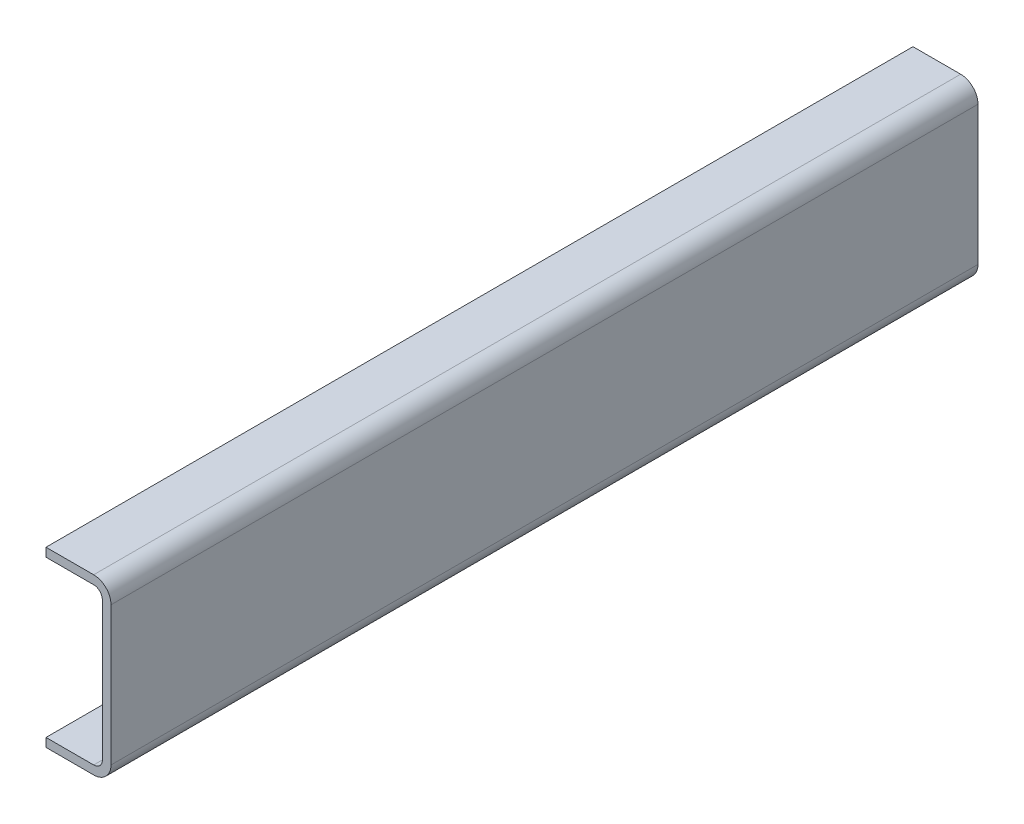
ISO-10303-21;
HEADER;
FILE_DESCRIPTION(('STEP AP214'),'2;1');
FILE_NAME('part.step','',(''),(''),'','','');
FILE_SCHEMA(('AUTOMOTIVE_DESIGN { 1 0 10303 214 1 1 1 1 }'));
ENDSEC;
DATA;
#1=APPLICATION_CONTEXT('core data for automotive mechanical design processes');
#2=APPLICATION_PROTOCOL_DEFINITION('international standard','automotive_design',2000,#1);
#3=PRODUCT_CONTEXT('',#1,'mechanical');
#4=PRODUCT('Part','Part','',(#3));
#5=PRODUCT_RELATED_PRODUCT_CATEGORY('part','',(#4));
#6=PRODUCT_DEFINITION_FORMATION('','',#4);
#7=PRODUCT_DEFINITION_CONTEXT('part definition',#1,'design');
#8=PRODUCT_DEFINITION('design','',#6,#7);
#9=PRODUCT_DEFINITION_SHAPE('','',#8);
#10=(LENGTH_UNIT() NAMED_UNIT(*) SI_UNIT(.MILLI.,.METRE.));
#11=(NAMED_UNIT(*) PLANE_ANGLE_UNIT() SI_UNIT($,.RADIAN.));
#12=(NAMED_UNIT(*) SI_UNIT($,.STERADIAN.) SOLID_ANGLE_UNIT());
#13=UNCERTAINTY_MEASURE_WITH_UNIT(LENGTH_MEASURE(1.E-05),#10,'distance_accuracy_value','');
#14=(GEOMETRIC_REPRESENTATION_CONTEXT(3) GLOBAL_UNCERTAINTY_ASSIGNED_CONTEXT((#13)) GLOBAL_UNIT_ASSIGNED_CONTEXT((#10,
#11,#12)) REPRESENTATION_CONTEXT('',''));
#15=CARTESIAN_POINT('',(0.,0.,0.));
#16=DIRECTION('',(0.,0.,1.));
#17=DIRECTION('',(1.,0.,0.));
#18=AXIS2_PLACEMENT_3D('',#15,#16,#17);
#19=CARTESIAN_POINT('',(-2.54,2.54,127.));
#20=DIRECTION('',(0.,0.,-1.));
#21=DIRECTION('',(-1.,0.,0.));
#22=AXIS2_PLACEMENT_3D('',#19,#20,#21);
#23=CYLINDRICAL_SURFACE('',#22,2.54);
#24=CARTESIAN_POINT('',(-2.54,2.54,0.));
#25=DIRECTION('',(0.,0.,1.));
#26=DIRECTION('',(-1.,0.,0.));
#27=AXIS2_PLACEMENT_3D('',#24,#25,#26);
#28=CIRCLE('',#27,2.54);
#29=CARTESIAN_POINT('',(-2.54000000000002,0.,0.));
#30=VERTEX_POINT('',#29);
#31=CARTESIAN_POINT('',(0.,2.54000000000002,0.));
#32=VERTEX_POINT('',#31);
#33=EDGE_CURVE('E189',#30,#32,#28,.T.);
#34=ORIENTED_EDGE('',*,*,#33,.T.);
#35=DIRECTION('',(0.,0.,-1.));
#36=VECTOR('',#35,1.);
#37=CARTESIAN_POINT('',(0.,2.54000000000002,127.));
#38=LINE('',#37,#36);
#39=CARTESIAN_POINT('',(0.,2.54000000000002,127.));
#40=VERTEX_POINT('',#39);
#41=EDGE_CURVE('E11',#40,#32,#38,.T.);
#42=ORIENTED_EDGE('',*,*,#41,.F.);
#43=CARTESIAN_POINT('',(-2.54,2.54,127.));
#44=DIRECTION('',(0.,0.,1.));
#45=DIRECTION('',(-1.,0.,0.));
#46=AXIS2_PLACEMENT_3D('',#43,#44,#45);
#47=CIRCLE('',#46,2.54);
#48=CARTESIAN_POINT('',(-2.54000000000002,0.,127.));
#49=VERTEX_POINT('',#48);
#50=EDGE_CURVE('E223',#49,#40,#47,.T.);
#51=ORIENTED_EDGE('',*,*,#50,.F.);
#52=DIRECTION('',(0.,0.,-1.));
#53=VECTOR('',#52,1.);
#54=CARTESIAN_POINT('',(-2.54000000000002,0.,127.));
#55=LINE('',#54,#53);
#56=EDGE_CURVE('E185',#49,#30,#55,.T.);
#57=ORIENTED_EDGE('',*,*,#56,.T.);
#58=EDGE_LOOP('',(#34,#42,#51,#57));
#59=FACE_BOUND('',#58,.T.);
#60=ADVANCED_FACE('F40',(#59),#23,.T.);
#61=CARTESIAN_POINT('',(0.,2.54000000000002,127.));
#62=DIRECTION('',(-1.,0.,0.));
#63=DIRECTION('',(0.,0.,1.));
#64=AXIS2_PLACEMENT_3D('',#61,#62,#63);
#65=PLANE('',#64);
#66=DIRECTION('',(0.,1.,0.));
#67=VECTOR('',#66,1.);
#68=CARTESIAN_POINT('',(0.,2.54000000000002,0.));
#69=LINE('',#68,#67);
#70=CARTESIAN_POINT('',(0.,22.86,0.));
#71=VERTEX_POINT('',#70);
#72=EDGE_CURVE('E193',#32,#71,#69,.T.);
#73=ORIENTED_EDGE('',*,*,#72,.T.);
#74=DIRECTION('',(0.,0.,-1.));
#75=VECTOR('',#74,1.);
#76=CARTESIAN_POINT('',(0.,22.86,127.));
#77=LINE('',#76,#75);
#78=CARTESIAN_POINT('',(0.,22.86,127.));
#79=VERTEX_POINT('',#78);
#80=EDGE_CURVE('E49',#79,#71,#77,.T.);
#81=ORIENTED_EDGE('',*,*,#80,.F.);
#82=DIRECTION('',(0.,1.,0.));
#83=VECTOR('',#82,1.);
#84=CARTESIAN_POINT('',(0.,2.54000000000002,127.));
#85=LINE('',#84,#83);
#86=EDGE_CURVE('E132',#40,#79,#85,.T.);
#87=ORIENTED_EDGE('',*,*,#86,.F.);
#88=ORIENTED_EDGE('',*,*,#41,.T.);
#89=EDGE_LOOP('',(#73,#81,#87,#88));
#90=FACE_BOUND('',#89,.T.);
#91=ADVANCED_FACE('F301',(#90),#65,.F.);
#92=CARTESIAN_POINT('',(-2.54,22.86,127.));
#93=DIRECTION('',(0.,0.,-1.));
#94=DIRECTION('',(-1.,0.,0.));
#95=AXIS2_PLACEMENT_3D('',#92,#93,#94);
#96=CYLINDRICAL_SURFACE('',#95,2.54);
#97=CARTESIAN_POINT('',(-2.54,22.86,0.));
#98=DIRECTION('',(0.,0.,1.));
#99=DIRECTION('',(1.,0.,0.));
#100=AXIS2_PLACEMENT_3D('',#97,#98,#99);
#101=CIRCLE('',#100,2.54);
#102=CARTESIAN_POINT('',(-2.54000000000002,25.4,0.));
#103=VERTEX_POINT('',#102);
#104=EDGE_CURVE('E196',#71,#103,#101,.T.);
#105=ORIENTED_EDGE('',*,*,#104,.T.);
#106=DIRECTION('',(0.,0.,-1.));
#107=VECTOR('',#106,1.);
#108=CARTESIAN_POINT('',(-2.54000000000002,25.4,127.));
#109=LINE('',#108,#107);
#110=CARTESIAN_POINT('',(-2.54000000000002,25.4,127.));
#111=VERTEX_POINT('',#110);
#112=EDGE_CURVE('E250',#111,#103,#109,.T.);
#113=ORIENTED_EDGE('',*,*,#112,.F.);
#114=CARTESIAN_POINT('',(-2.54,22.86,127.));
#115=DIRECTION('',(0.,0.,1.));
#116=DIRECTION('',(1.,0.,0.));
#117=AXIS2_PLACEMENT_3D('',#114,#115,#116);
#118=CIRCLE('',#117,2.54);
#119=EDGE_CURVE('E260',#79,#111,#118,.T.);
#120=ORIENTED_EDGE('',*,*,#119,.F.);
#121=ORIENTED_EDGE('',*,*,#80,.T.);
#122=EDGE_LOOP('',(#105,#113,#120,#121));
#123=FACE_BOUND('',#122,.T.);
#124=ADVANCED_FACE('F258',(#123),#96,.T.);
#125=CARTESIAN_POINT('',(-2.54000000000002,25.4,127.));
#126=DIRECTION('',(0.,-1.,0.));
#127=DIRECTION('',(0.,0.,-1.));
#128=AXIS2_PLACEMENT_3D('',#125,#126,#127);
#129=PLANE('',#128);
#130=DIRECTION('',(-1.,0.,0.));
#131=VECTOR('',#130,1.);
#132=CARTESIAN_POINT('',(-2.54000000000002,25.4,0.));
#133=LINE('',#132,#131);
#134=CARTESIAN_POINT('',(-9.525,25.4,0.));
#135=VERTEX_POINT('',#134);
#136=EDGE_CURVE('E199',#103,#135,#133,.T.);
#137=ORIENTED_EDGE('',*,*,#136,.T.);
#138=DIRECTION('',(0.,0.,-1.));
#139=VECTOR('',#138,1.);
#140=CARTESIAN_POINT('',(-9.525,25.4,127.));
#141=LINE('',#140,#139);
#142=CARTESIAN_POINT('',(-9.525,25.4,127.));
#143=VERTEX_POINT('',#142);
#144=EDGE_CURVE('E246',#143,#135,#141,.T.);
#145=ORIENTED_EDGE('',*,*,#144,.F.);
#146=DIRECTION('',(-1.,0.,0.));
#147=VECTOR('',#146,1.);
#148=CARTESIAN_POINT('',(-2.54000000000002,25.4,127.));
#149=LINE('',#148,#147);
#150=EDGE_CURVE('E279',#111,#143,#149,.T.);
#151=ORIENTED_EDGE('',*,*,#150,.F.);
#152=ORIENTED_EDGE('',*,*,#112,.T.);
#153=EDGE_LOOP('',(#137,#145,#151,#152));
#154=FACE_BOUND('',#153,.T.);
#155=ADVANCED_FACE('F269',(#154),#129,.F.);
#156=CARTESIAN_POINT('',(-9.525,25.4,127.));
#157=DIRECTION('',(1.,0.,0.));
#158=DIRECTION('',(0.,0.,-1.));
#159=AXIS2_PLACEMENT_3D('',#156,#157,#158);
#160=PLANE('',#159);
#161=DIRECTION('',(0.,-1.,0.));
#162=VECTOR('',#161,1.);
#163=CARTESIAN_POINT('',(-9.525,25.4,0.));
#164=LINE('',#163,#162);
#165=CARTESIAN_POINT('',(-9.525,24.13,0.));
#166=VERTEX_POINT('',#165);
#167=EDGE_CURVE('E202',#135,#166,#164,.T.);
#168=ORIENTED_EDGE('',*,*,#167,.T.);
#169=DIRECTION('',(0.,0.,-1.));
#170=VECTOR('',#169,1.);
#171=CARTESIAN_POINT('',(-9.525,24.13,127.));
#172=LINE('',#171,#170);
#173=CARTESIAN_POINT('',(-9.525,24.13,127.));
#174=VERTEX_POINT('',#173);
#175=EDGE_CURVE('E242',#174,#166,#172,.T.);
#176=ORIENTED_EDGE('',*,*,#175,.F.);
#177=DIRECTION('',(0.,-1.,0.));
#178=VECTOR('',#177,1.);
#179=CARTESIAN_POINT('',(-9.525,25.4,127.));
#180=LINE('',#179,#178);
#181=EDGE_CURVE('E275',#143,#174,#180,.T.);
#182=ORIENTED_EDGE('',*,*,#181,.F.);
#183=ORIENTED_EDGE('',*,*,#144,.T.);
#184=EDGE_LOOP('',(#168,#176,#182,#183));
#185=FACE_BOUND('',#184,.T.);
#186=ADVANCED_FACE('F273',(#185),#160,.F.);
#187=CARTESIAN_POINT('',(-2.54000000000001,24.13,127.));
#188=DIRECTION('',(0.,1.,0.));
#189=DIRECTION('',(0.,0.,1.));
#190=AXIS2_PLACEMENT_3D('',#187,#188,#189);
#191=PLANE('',#190);
#192=DIRECTION('',(1.,0.,0.));
#193=VECTOR('',#192,1.);
#194=CARTESIAN_POINT('',(-2.54000000000001,24.13,0.));
#195=LINE('',#194,#193);
#196=CARTESIAN_POINT('',(-2.54000000000001,24.13,0.));
#197=VERTEX_POINT('',#196);
#198=EDGE_CURVE('E205',#166,#197,#195,.T.);
#199=ORIENTED_EDGE('',*,*,#198,.T.);
#200=DIRECTION('',(0.,0.,-1.));
#201=VECTOR('',#200,1.);
#202=CARTESIAN_POINT('',(-2.54000000000001,24.13,127.));
#203=LINE('',#202,#201);
#204=CARTESIAN_POINT('',(-2.54000000000001,24.13,127.));
#205=VERTEX_POINT('',#204);
#206=EDGE_CURVE('E238',#205,#197,#203,.T.);
#207=ORIENTED_EDGE('',*,*,#206,.F.);
#208=DIRECTION('',(1.,0.,0.));
#209=VECTOR('',#208,1.);
#210=CARTESIAN_POINT('',(-2.54000000000001,24.13,127.));
#211=LINE('',#210,#209);
#212=EDGE_CURVE('E278',#174,#205,#211,.T.);
#213=ORIENTED_EDGE('',*,*,#212,.F.);
#214=ORIENTED_EDGE('',*,*,#175,.T.);
#215=EDGE_LOOP('',(#199,#207,#213,#214));
#216=FACE_BOUND('',#215,.T.);
#217=ADVANCED_FACE('F313',(#216),#191,.F.);
#218=CARTESIAN_POINT('',(-2.54,22.86,127.));
#219=DIRECTION('',(0.,0.,-1.));
#220=DIRECTION('',(-1.,0.,0.));
#221=AXIS2_PLACEMENT_3D('',#218,#219,#220);
#222=CYLINDRICAL_SURFACE('',#221,1.27);
#223=CARTESIAN_POINT('',(-2.54,22.86,0.));
#224=DIRECTION('',(0.,0.,-1.));
#225=DIRECTION('',(1.,0.,0.));
#226=AXIS2_PLACEMENT_3D('',#223,#224,#225);
#227=CIRCLE('',#226,1.27);
#228=CARTESIAN_POINT('',(-1.27,22.86,0.));
#229=VERTEX_POINT('',#228);
#230=EDGE_CURVE('E208',#197,#229,#227,.T.);
#231=ORIENTED_EDGE('',*,*,#230,.T.);
#232=DIRECTION('',(0.,0.,-1.));
#233=VECTOR('',#232,1.);
#234=CARTESIAN_POINT('',(-1.27,22.86,127.));
#235=LINE('',#234,#233);
#236=CARTESIAN_POINT('',(-1.27,22.86,127.));
#237=VERTEX_POINT('',#236);
#238=EDGE_CURVE('E234',#237,#229,#235,.T.);
#239=ORIENTED_EDGE('',*,*,#238,.F.);
#240=CARTESIAN_POINT('',(-2.54,22.86,127.));
#241=DIRECTION('',(0.,0.,-1.));
#242=DIRECTION('',(1.,0.,0.));
#243=AXIS2_PLACEMENT_3D('',#240,#241,#242);
#244=CIRCLE('',#243,1.27);
#245=EDGE_CURVE('E284',#205,#237,#244,.T.);
#246=ORIENTED_EDGE('',*,*,#245,.F.);
#247=ORIENTED_EDGE('',*,*,#206,.T.);
#248=EDGE_LOOP('',(#231,#239,#246,#247));
#249=FACE_BOUND('',#248,.T.);
#250=ADVANCED_FACE('F316',(#249),#222,.F.);
#251=CARTESIAN_POINT('',(-1.27,2.54000000000001,127.));
#252=DIRECTION('',(1.,0.,0.));
#253=DIRECTION('',(0.,1.,0.));
#254=AXIS2_PLACEMENT_3D('',#251,#252,#253);
#255=PLANE('',#254);
#256=DIRECTION('',(0.,-1.,0.));
#257=VECTOR('',#256,1.);
#258=CARTESIAN_POINT('',(-1.27,2.54000000000001,0.));
#259=LINE('',#258,#257);
#260=CARTESIAN_POINT('',(-1.27,2.54000000000001,0.));
#261=VERTEX_POINT('',#260);
#262=EDGE_CURVE('E211',#229,#261,#259,.T.);
#263=ORIENTED_EDGE('',*,*,#262,.T.);
#264=DIRECTION('',(0.,0.,-1.));
#265=VECTOR('',#264,1.);
#266=CARTESIAN_POINT('',(-1.27,2.54000000000001,127.));
#267=LINE('',#266,#265);
#268=CARTESIAN_POINT('',(-1.27,2.54000000000001,127.));
#269=VERTEX_POINT('',#268);
#270=EDGE_CURVE('E230',#269,#261,#267,.T.);
#271=ORIENTED_EDGE('',*,*,#270,.F.);
#272=DIRECTION('',(0.,-1.,0.));
#273=VECTOR('',#272,1.);
#274=CARTESIAN_POINT('',(-1.27,2.54000000000001,127.));
#275=LINE('',#274,#273);
#276=EDGE_CURVE('E291',#237,#269,#275,.T.);
#277=ORIENTED_EDGE('',*,*,#276,.F.);
#278=ORIENTED_EDGE('',*,*,#238,.T.);
#279=EDGE_LOOP('',(#263,#271,#277,#278));
#280=FACE_BOUND('',#279,.T.);
#281=ADVANCED_FACE('F320',(#280),#255,.F.);
#282=CARTESIAN_POINT('',(-2.54,2.54,127.));
#283=DIRECTION('',(0.,0.,-1.));
#284=DIRECTION('',(-1.,0.,0.));
#285=AXIS2_PLACEMENT_3D('',#282,#283,#284);
#286=CYLINDRICAL_SURFACE('',#285,1.27);
#287=CARTESIAN_POINT('',(-2.54,2.54,0.));
#288=DIRECTION('',(0.,0.,-1.));
#289=DIRECTION('',(-1.,0.,0.));
#290=AXIS2_PLACEMENT_3D('',#287,#288,#289);
#291=CIRCLE('',#290,1.27);
#292=CARTESIAN_POINT('',(-2.54000000000002,1.27,0.));
#293=VERTEX_POINT('',#292);
#294=EDGE_CURVE('E214',#261,#293,#291,.T.);
#295=ORIENTED_EDGE('',*,*,#294,.T.);
#296=DIRECTION('',(0.,0.,-1.));
#297=VECTOR('',#296,1.);
#298=CARTESIAN_POINT('',(-2.54000000000002,1.27,127.));
#299=LINE('',#298,#297);
#300=CARTESIAN_POINT('',(-2.54000000000002,1.27,127.));
#301=VERTEX_POINT('',#300);
#302=EDGE_CURVE('E178',#301,#293,#299,.T.);
#303=ORIENTED_EDGE('',*,*,#302,.F.);
#304=CARTESIAN_POINT('',(-2.54,2.54,127.));
#305=DIRECTION('',(0.,0.,-1.));
#306=DIRECTION('',(-1.,0.,0.));
#307=AXIS2_PLACEMENT_3D('',#304,#305,#306);
#308=CIRCLE('',#307,1.27);
#309=EDGE_CURVE('E167',#269,#301,#308,.T.);
#310=ORIENTED_EDGE('',*,*,#309,.F.);
#311=ORIENTED_EDGE('',*,*,#270,.T.);
#312=EDGE_LOOP('',(#295,#303,#310,#311));
#313=FACE_BOUND('',#312,.T.);
#314=ADVANCED_FACE('F324',(#313),#286,.F.);
#315=CARTESIAN_POINT('',(-2.54000000000002,1.27,127.));
#316=DIRECTION('',(0.,-1.,0.));
#317=DIRECTION('',(0.,0.,-1.));
#318=AXIS2_PLACEMENT_3D('',#315,#316,#317);
#319=PLANE('',#318);
#320=DIRECTION('',(-1.,0.,0.));
#321=VECTOR('',#320,1.);
#322=CARTESIAN_POINT('',(-2.54000000000002,1.27,0.));
#323=LINE('',#322,#321);
#324=CARTESIAN_POINT('',(-9.525,1.27,0.));
#325=VERTEX_POINT('',#324);
#326=EDGE_CURVE('E176',#293,#325,#323,.T.);
#327=ORIENTED_EDGE('',*,*,#326,.T.);
#328=DIRECTION('',(0.,0.,-1.));
#329=VECTOR('',#328,1.);
#330=CARTESIAN_POINT('',(-9.525,1.27,127.));
#331=LINE('',#330,#329);
#332=CARTESIAN_POINT('',(-9.525,1.27,127.));
#333=VERTEX_POINT('',#332);
#334=EDGE_CURVE('E173',#333,#325,#331,.T.);
#335=ORIENTED_EDGE('',*,*,#334,.F.);
#336=DIRECTION('',(-1.,0.,0.));
#337=VECTOR('',#336,1.);
#338=CARTESIAN_POINT('',(-2.54000000000002,1.27,127.));
#339=LINE('',#338,#337);
#340=EDGE_CURVE('E161',#301,#333,#339,.T.);
#341=ORIENTED_EDGE('',*,*,#340,.F.);
#342=ORIENTED_EDGE('',*,*,#302,.T.);
#343=EDGE_LOOP('',(#327,#335,#341,#342));
#344=FACE_BOUND('',#343,.T.);
#345=ADVANCED_FACE('F174',(#344),#319,.F.);
#346=CARTESIAN_POINT('',(-9.525,1.27,127.));
#347=DIRECTION('',(1.,0.,0.));
#348=DIRECTION('',(0.,0.,-1.));
#349=AXIS2_PLACEMENT_3D('',#346,#347,#348);
#350=PLANE('',#349);
#351=DIRECTION('',(0.,-1.,0.));
#352=VECTOR('',#351,1.);
#353=CARTESIAN_POINT('',(-9.525,1.27,0.));
#354=LINE('',#353,#352);
#355=CARTESIAN_POINT('',(-9.525,0.,0.));
#356=VERTEX_POINT('',#355);
#357=EDGE_CURVE('E114',#325,#356,#354,.T.);
#358=ORIENTED_EDGE('',*,*,#357,.T.);
#359=DIRECTION('',(0.,0.,-1.));
#360=VECTOR('',#359,1.);
#361=CARTESIAN_POINT('',(-9.525,0.,127.));
#362=LINE('',#361,#360);
#363=CARTESIAN_POINT('',(-9.525,0.,127.));
#364=VERTEX_POINT('',#363);
#365=EDGE_CURVE('E179',#364,#356,#362,.T.);
#366=ORIENTED_EDGE('',*,*,#365,.F.);
#367=DIRECTION('',(0.,-1.,0.));
#368=VECTOR('',#367,1.);
#369=CARTESIAN_POINT('',(-9.525,1.27,127.));
#370=LINE('',#369,#368);
#371=EDGE_CURVE('E165',#333,#364,#370,.T.);
#372=ORIENTED_EDGE('',*,*,#371,.F.);
#373=ORIENTED_EDGE('',*,*,#334,.T.);
#374=EDGE_LOOP('',(#358,#366,#372,#373));
#375=FACE_BOUND('',#374,.T.);
#376=ADVANCED_FACE('F181',(#375),#350,.F.);
#377=CARTESIAN_POINT('',(-2.54000000000002,0.,127.));
#378=DIRECTION('',(0.,1.,0.));
#379=DIRECTION('',(0.,0.,1.));
#380=AXIS2_PLACEMENT_3D('',#377,#378,#379);
#381=PLANE('',#380);
#382=DIRECTION('',(1.,0.,0.));
#383=VECTOR('',#382,1.);
#384=CARTESIAN_POINT('',(-2.54000000000002,0.,0.));
#385=LINE('',#384,#383);
#386=EDGE_CURVE('E121',#356,#30,#385,.T.);
#387=ORIENTED_EDGE('',*,*,#386,.T.);
#388=ORIENTED_EDGE('',*,*,#56,.F.);
#389=DIRECTION('',(1.,0.,0.));
#390=VECTOR('',#389,1.);
#391=CARTESIAN_POINT('',(-2.54000000000002,0.,127.));
#392=LINE('',#391,#390);
#393=EDGE_CURVE('E60',#364,#49,#392,.T.);
#394=ORIENTED_EDGE('',*,*,#393,.F.);
#395=ORIENTED_EDGE('',*,*,#365,.T.);
#396=EDGE_LOOP('',(#387,#388,#394,#395));
#397=FACE_BOUND('',#396,.T.);
#398=ADVANCED_FACE('F333',(#397),#381,.F.);
#399=CARTESIAN_POINT('',(-2.54,2.54,127.));
#400=DIRECTION('',(0.,0.,-1.));
#401=DIRECTION('',(-1.,0.,0.));
#402=AXIS2_PLACEMENT_3D('',#399,#400,#401);
#403=PLANE('',#402);
#404=ORIENTED_EDGE('',*,*,#50,.T.);
#405=ORIENTED_EDGE('',*,*,#86,.T.);
#406=ORIENTED_EDGE('',*,*,#119,.T.);
#407=ORIENTED_EDGE('',*,*,#150,.T.);
#408=ORIENTED_EDGE('',*,*,#181,.T.);
#409=ORIENTED_EDGE('',*,*,#212,.T.);
#410=ORIENTED_EDGE('',*,*,#245,.T.);
#411=ORIENTED_EDGE('',*,*,#276,.T.);
#412=ORIENTED_EDGE('',*,*,#309,.T.);
#413=ORIENTED_EDGE('',*,*,#340,.T.);
#414=ORIENTED_EDGE('',*,*,#371,.T.);
#415=ORIENTED_EDGE('',*,*,#393,.T.);
#416=EDGE_LOOP('',(#404,#405,#406,#407,#408,#409,#410,#411,#412,#413,#414,#415));
#417=FACE_BOUND('',#416,.T.);
#418=ADVANCED_FACE('F163',(#417),#403,.F.);
#419=CARTESIAN_POINT('',(-2.54,2.54,0.));
#420=DIRECTION('',(0.,0.,-1.));
#421=DIRECTION('',(-1.,0.,0.));
#422=AXIS2_PLACEMENT_3D('',#419,#420,#421);
#423=PLANE('',#422);
#424=ORIENTED_EDGE('',*,*,#33,.F.);
#425=ORIENTED_EDGE('',*,*,#386,.F.);
#426=ORIENTED_EDGE('',*,*,#357,.F.);
#427=ORIENTED_EDGE('',*,*,#326,.F.);
#428=ORIENTED_EDGE('',*,*,#294,.F.);
#429=ORIENTED_EDGE('',*,*,#262,.F.);
#430=ORIENTED_EDGE('',*,*,#230,.F.);
#431=ORIENTED_EDGE('',*,*,#198,.F.);
#432=ORIENTED_EDGE('',*,*,#167,.F.);
#433=ORIENTED_EDGE('',*,*,#136,.F.);
#434=ORIENTED_EDGE('',*,*,#104,.F.);
#435=ORIENTED_EDGE('',*,*,#72,.F.);
#436=EDGE_LOOP('',(#424,#425,#426,#427,#428,#429,#430,#431,#432,#433,#434,#435));
#437=FACE_BOUND('',#436,.T.);
#438=ADVANCED_FACE('F264',(#437),#423,.T.);
#439=CLOSED_SHELL('',(#60,#91,#124,#155,#186,#217,#250,#281,#314,#345,#376,#398,#418,#438));
#440=MANIFOLD_SOLID_BREP('B2',#439);
#441=ADVANCED_BREP_SHAPE_REPRESENTATION('',(#18,#440),#14);
#442=SHAPE_DEFINITION_REPRESENTATION(#9,#441);
ENDSEC;
END-ISO-10303-21;
